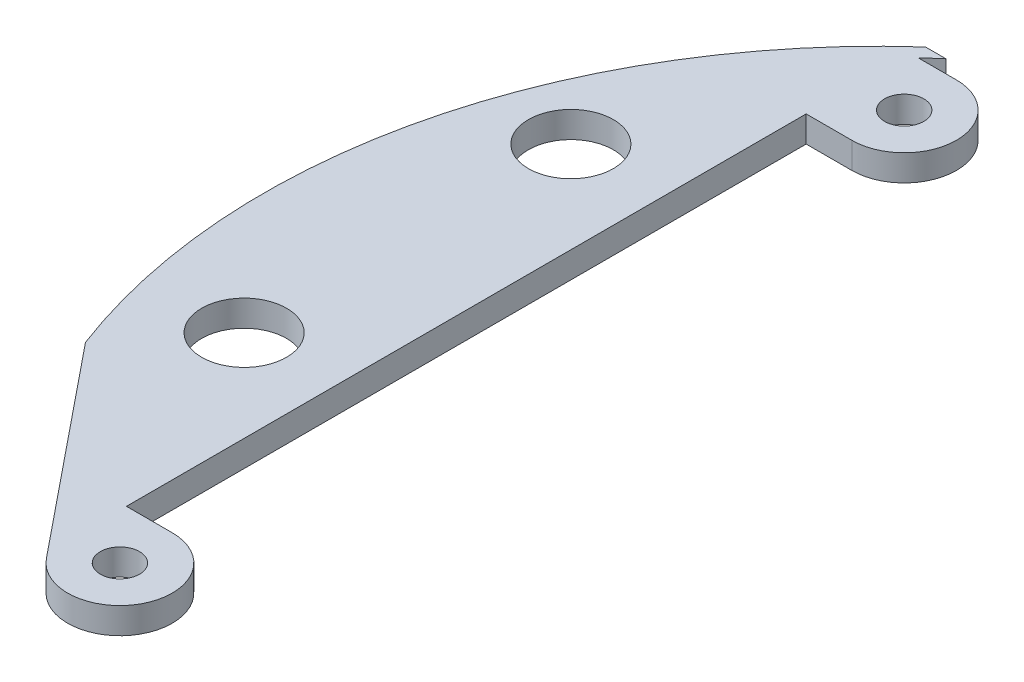
ISO-10303-21;
HEADER;
FILE_DESCRIPTION(('STEP AP214'),'2;1');
FILE_NAME('part.step','',(''),(''),'','','');
FILE_SCHEMA(('AUTOMOTIVE_DESIGN { 1 0 10303 214 1 1 1 1 }'));
ENDSEC;
DATA;
#1=APPLICATION_CONTEXT('core data for automotive mechanical design processes');
#2=APPLICATION_PROTOCOL_DEFINITION('international standard','automotive_design',2000,#1);
#3=PRODUCT_CONTEXT('',#1,'mechanical');
#4=PRODUCT('Part','Part','',(#3));
#5=PRODUCT_RELATED_PRODUCT_CATEGORY('part','',(#4));
#6=PRODUCT_DEFINITION_FORMATION('','',#4);
#7=PRODUCT_DEFINITION_CONTEXT('part definition',#1,'design');
#8=PRODUCT_DEFINITION('design','',#6,#7);
#9=PRODUCT_DEFINITION_SHAPE('','',#8);
#10=(LENGTH_UNIT() NAMED_UNIT(*) SI_UNIT(.MILLI.,.METRE.));
#11=(NAMED_UNIT(*) PLANE_ANGLE_UNIT() SI_UNIT($,.RADIAN.));
#12=(NAMED_UNIT(*) SI_UNIT($,.STERADIAN.) SOLID_ANGLE_UNIT());
#13=UNCERTAINTY_MEASURE_WITH_UNIT(LENGTH_MEASURE(1.E-05),#10,'distance_accuracy_value','');
#14=(GEOMETRIC_REPRESENTATION_CONTEXT(3) GLOBAL_UNCERTAINTY_ASSIGNED_CONTEXT((#13)) GLOBAL_UNIT_ASSIGNED_CONTEXT((#10,
#11,#12)) REPRESENTATION_CONTEXT('',''));
#15=CARTESIAN_POINT('',(0.,0.,0.));
#16=DIRECTION('',(0.,0.,1.));
#17=DIRECTION('',(1.,0.,0.));
#18=AXIS2_PLACEMENT_3D('',#15,#16,#17);
#19=CARTESIAN_POINT('',(0.,2.,0.));
#20=DIRECTION('',(0.,-1.,0.));
#21=DIRECTION('',(0.,0.,-1.));
#22=AXIS2_PLACEMENT_3D('',#19,#20,#21);
#23=PLANE('',#22);
#24=CARTESIAN_POINT('',(-10.5,2.,-15.));
#25=DIRECTION('',(0.,1.,0.));
#26=DIRECTION('',(0.,0.,1.));
#27=AXIS2_PLACEMENT_3D('',#24,#25,#26);
#28=CIRCLE('',#27,3.25);
#29=CARTESIAN_POINT('',(-10.5,2.,-11.75));
#30=VERTEX_POINT('',#29);
#31=EDGE_CURVE('E234',#30,#30,#28,.T.);
#32=ORIENTED_EDGE('',*,*,#31,.F.);
#33=EDGE_LOOP('',(#32));
#34=FACE_BOUND('',#33,.T.);
#35=CARTESIAN_POINT('',(-10.5,2.,10.));
#36=DIRECTION('',(0.,1.,0.));
#37=DIRECTION('',(0.,0.,1.));
#38=AXIS2_PLACEMENT_3D('',#35,#36,#37);
#39=CIRCLE('',#38,3.25);
#40=CARTESIAN_POINT('',(-10.5,2.,13.25));
#41=VERTEX_POINT('',#40);
#42=EDGE_CURVE('E238',#41,#41,#39,.T.);
#43=ORIENTED_EDGE('',*,*,#42,.F.);
#44=EDGE_LOOP('',(#43));
#45=FACE_BOUND('',#44,.T.);
#46=CARTESIAN_POINT('',(0.,2.,-30.));
#47=DIRECTION('',(0.,1.,0.));
#48=DIRECTION('',(0.,0.,1.));
#49=AXIS2_PLACEMENT_3D('',#46,#47,#48);
#50=CIRCLE('',#49,1.5);
#51=CARTESIAN_POINT('',(0.,2.,-28.5));
#52=VERTEX_POINT('',#51);
#53=EDGE_CURVE('E297',#52,#52,#50,.T.);
#54=ORIENTED_EDGE('',*,*,#53,.F.);
#55=EDGE_LOOP('',(#54));
#56=FACE_BOUND('',#55,.T.);
#57=CARTESIAN_POINT('',(0.,2.,30.));
#58=DIRECTION('',(0.,1.,0.));
#59=DIRECTION('',(0.,0.,1.));
#60=AXIS2_PLACEMENT_3D('',#57,#58,#59);
#61=CIRCLE('',#60,1.5);
#62=CARTESIAN_POINT('',(0.,2.,31.5));
#63=VERTEX_POINT('',#62);
#64=EDGE_CURVE('E291',#63,#63,#61,.T.);
#65=ORIENTED_EDGE('',*,*,#64,.F.);
#66=EDGE_LOOP('',(#65));
#67=FACE_BOUND('',#66,.T.);
#68=CARTESIAN_POINT('',(28.0000000000002,2.,0.));
#69=DIRECTION('',(0.,1.,0.));
#70=DIRECTION('',(0.,0.,1.));
#71=AXIS2_PLACEMENT_3D('',#68,#69,#70);
#72=CIRCLE('',#71,47.);
#73=CARTESIAN_POINT('',(-3.36877428271602,2.,-35.));
#74=VERTEX_POINT('',#73);
#75=CARTESIAN_POINT('',(-15.9316189320438,2.,16.7036779785075));
#76=VERTEX_POINT('',#75);
#77=EDGE_CURVE('E222',#74,#76,#72,.T.);
#78=ORIENTED_EDGE('',*,*,#77,.T.);
#79=DIRECTION('',(0.629837318418098,0.,0.77672707711776));
#80=VECTOR('',#79,1.);
#81=CARTESIAN_POINT('',(-17.7832592903084,2.,14.4202007038354));
#82=LINE('',#81,#80);
#83=CARTESIAN_POINT('',(-3.10690830847104,2.,32.5193492736724));
#84=VERTEX_POINT('',#83);
#85=EDGE_CURVE('E226',#76,#84,#82,.T.);
#86=ORIENTED_EDGE('',*,*,#85,.T.);
#87=CARTESIAN_POINT('',(0.,2.,30.));
#88=DIRECTION('',(0.,1.,0.));
#89=DIRECTION('',(0.,0.,1.));
#90=AXIS2_PLACEMENT_3D('',#87,#88,#89);
#91=CIRCLE('',#90,4.);
#92=CARTESIAN_POINT('',(0.,2.,26.));
#93=VERTEX_POINT('',#92);
#94=EDGE_CURVE('E228',#93,#84,#91,.F.);
#95=ORIENTED_EDGE('',*,*,#94,.F.);
#96=DIRECTION('',(1.,0.,0.));
#97=VECTOR('',#96,1.);
#98=CARTESIAN_POINT('',(-3.,2.,26.));
#99=LINE('',#98,#97);
#100=CARTESIAN_POINT('',(-3.5,2.,26.));
#101=VERTEX_POINT('',#100);
#102=EDGE_CURVE('E284',#101,#93,#99,.T.);
#103=ORIENTED_EDGE('',*,*,#102,.F.);
#104=DIRECTION('',(0.,0.,-1.));
#105=VECTOR('',#104,1.);
#106=CARTESIAN_POINT('',(-3.5,2.,0.));
#107=LINE('',#106,#105);
#108=CARTESIAN_POINT('',(-3.5,2.,-26.));
#109=VERTEX_POINT('',#108);
#110=EDGE_CURVE('E269',#101,#109,#107,.T.);
#111=ORIENTED_EDGE('',*,*,#110,.T.);
#112=DIRECTION('',(-1.,0.,0.));
#113=VECTOR('',#112,1.);
#114=CARTESIAN_POINT('',(-3.,2.,-26.));
#115=LINE('',#114,#113);
#116=CARTESIAN_POINT('',(0.,2.,-26.));
#117=VERTEX_POINT('',#116);
#118=EDGE_CURVE('E282',#117,#109,#115,.T.);
#119=ORIENTED_EDGE('',*,*,#118,.F.);
#120=CARTESIAN_POINT('',(0.,2.,-30.));
#121=DIRECTION('',(0.,1.,0.));
#122=DIRECTION('',(0.,0.,1.));
#123=AXIS2_PLACEMENT_3D('',#120,#121,#122);
#124=CIRCLE('',#123,4.);
#125=CARTESIAN_POINT('',(0.,2.,-34.));
#126=VERTEX_POINT('',#125);
#127=EDGE_CURVE('E143',#117,#126,#124,.T.);
#128=ORIENTED_EDGE('',*,*,#127,.T.);
#129=DIRECTION('',(-1.,0.,0.));
#130=VECTOR('',#129,1.);
#131=CARTESIAN_POINT('',(0.,2.,-34.));
#132=LINE('',#131,#130);
#133=CARTESIAN_POINT('',(-2.93362068832025,2.,-34.));
#134=VERTEX_POINT('',#133);
#135=EDGE_CURVE('E252',#126,#134,#132,.T.);
#136=ORIENTED_EDGE('',*,*,#135,.T.);
#137=CARTESIAN_POINT('',(28.0000000000002,2.,-0.129629629629611));
#138=DIRECTION('',(0.,1.,0.));
#139=DIRECTION('',(0.,0.,1.));
#140=AXIS2_PLACEMENT_3D('',#137,#138,#139);
#141=CIRCLE('',#140,45.8703703703704);
#142=CARTESIAN_POINT('',(-1.80181451100141,2.,-35.));
#143=VERTEX_POINT('',#142);
#144=EDGE_CURVE('E249',#143,#134,#141,.T.);
#145=ORIENTED_EDGE('',*,*,#144,.F.);
#146=DIRECTION('',(-1.,0.,0.));
#147=VECTOR('',#146,1.);
#148=CARTESIAN_POINT('',(-10.,2.,-35.));
#149=LINE('',#148,#147);
#150=EDGE_CURVE('E12',#143,#74,#149,.T.);
#151=ORIENTED_EDGE('',*,*,#150,.T.);
#152=EDGE_LOOP('',(#78,#86,#95,#103,#111,#119,#128,#136,#145,#151));
#153=FACE_BOUND('',#152,.T.);
#154=ADVANCED_FACE('F128',(#34,#45,#56,#67,#153),#23,.F.);
#155=CARTESIAN_POINT('',(0.,0.,0.));
#156=DIRECTION('',(0.,-1.,0.));
#157=DIRECTION('',(0.,0.,-1.));
#158=AXIS2_PLACEMENT_3D('',#155,#156,#157);
#159=PLANE('',#158);
#160=CARTESIAN_POINT('',(-10.5,0.,-15.));
#161=DIRECTION('',(0.,1.,0.));
#162=DIRECTION('',(0.,0.,1.));
#163=AXIS2_PLACEMENT_3D('',#160,#161,#162);
#164=CIRCLE('',#163,3.25);
#165=CARTESIAN_POINT('',(-10.5,0.,-11.75));
#166=VERTEX_POINT('',#165);
#167=EDGE_CURVE('E229',#166,#166,#164,.T.);
#168=ORIENTED_EDGE('',*,*,#167,.T.);
#169=EDGE_LOOP('',(#168));
#170=FACE_BOUND('',#169,.T.);
#171=CARTESIAN_POINT('',(-10.5,0.,10.));
#172=DIRECTION('',(0.,1.,0.));
#173=DIRECTION('',(0.,0.,1.));
#174=AXIS2_PLACEMENT_3D('',#171,#172,#173);
#175=CIRCLE('',#174,3.25);
#176=CARTESIAN_POINT('',(-10.5,0.,13.25));
#177=VERTEX_POINT('',#176);
#178=EDGE_CURVE('E471',#177,#177,#175,.T.);
#179=ORIENTED_EDGE('',*,*,#178,.T.);
#180=EDGE_LOOP('',(#179));
#181=FACE_BOUND('',#180,.T.);
#182=CARTESIAN_POINT('',(0.,0.,-30.));
#183=DIRECTION('',(0.,1.,0.));
#184=DIRECTION('',(0.,0.,1.));
#185=AXIS2_PLACEMENT_3D('',#182,#183,#184);
#186=CIRCLE('',#185,1.5);
#187=CARTESIAN_POINT('',(0.,0.,-28.5));
#188=VERTEX_POINT('',#187);
#189=EDGE_CURVE('E294',#188,#188,#186,.T.);
#190=ORIENTED_EDGE('',*,*,#189,.T.);
#191=EDGE_LOOP('',(#190));
#192=FACE_BOUND('',#191,.T.);
#193=CARTESIAN_POINT('',(0.,0.,30.));
#194=DIRECTION('',(0.,1.,0.));
#195=DIRECTION('',(0.,0.,1.));
#196=AXIS2_PLACEMENT_3D('',#193,#194,#195);
#197=CIRCLE('',#196,1.5);
#198=CARTESIAN_POINT('',(0.,0.,31.5));
#199=VERTEX_POINT('',#198);
#200=EDGE_CURVE('E288',#199,#199,#197,.T.);
#201=ORIENTED_EDGE('',*,*,#200,.T.);
#202=EDGE_LOOP('',(#201));
#203=FACE_BOUND('',#202,.T.);
#204=DIRECTION('',(0.629837318418098,0.,0.77672707711776));
#205=VECTOR('',#204,1.);
#206=CARTESIAN_POINT('',(-17.7832592903084,0.,14.4202007038354));
#207=LINE('',#206,#205);
#208=CARTESIAN_POINT('',(-15.9316189320438,0.,16.7036779785075));
#209=VERTEX_POINT('',#208);
#210=CARTESIAN_POINT('',(-3.10690830847104,0.,32.5193492736724));
#211=VERTEX_POINT('',#210);
#212=EDGE_CURVE('E205',#209,#211,#207,.T.);
#213=ORIENTED_EDGE('',*,*,#212,.F.);
#214=CARTESIAN_POINT('',(28.0000000000002,0.,0.));
#215=DIRECTION('',(0.,1.,0.));
#216=DIRECTION('',(0.,0.,1.));
#217=AXIS2_PLACEMENT_3D('',#214,#215,#216);
#218=CIRCLE('',#217,47.);
#219=CARTESIAN_POINT('',(-3.36877428271602,0.,-35.));
#220=VERTEX_POINT('',#219);
#221=EDGE_CURVE('E209',#220,#209,#218,.T.);
#222=ORIENTED_EDGE('',*,*,#221,.F.);
#223=DIRECTION('',(-1.,0.,0.));
#224=VECTOR('',#223,1.);
#225=CARTESIAN_POINT('',(-10.,0.,-35.));
#226=LINE('',#225,#224);
#227=CARTESIAN_POINT('',(-1.80181451100141,0.,-35.));
#228=VERTEX_POINT('',#227);
#229=EDGE_CURVE('E132',#228,#220,#226,.T.);
#230=ORIENTED_EDGE('',*,*,#229,.F.);
#231=CARTESIAN_POINT('',(28.0000000000002,0.,-0.129629629629611));
#232=DIRECTION('',(0.,1.,0.));
#233=DIRECTION('',(0.,0.,1.));
#234=AXIS2_PLACEMENT_3D('',#231,#232,#233);
#235=CIRCLE('',#234,45.8703703703704);
#236=CARTESIAN_POINT('',(-2.93362068832025,0.,-34.));
#237=VERTEX_POINT('',#236);
#238=EDGE_CURVE('E214',#228,#237,#235,.T.);
#239=ORIENTED_EDGE('',*,*,#238,.T.);
#240=DIRECTION('',(-1.,0.,0.));
#241=VECTOR('',#240,1.);
#242=CARTESIAN_POINT('',(0.,0.,-34.));
#243=LINE('',#242,#241);
#244=CARTESIAN_POINT('',(0.,0.,-34.));
#245=VERTEX_POINT('',#244);
#246=EDGE_CURVE('E243',#245,#237,#243,.T.);
#247=ORIENTED_EDGE('',*,*,#246,.F.);
#248=CARTESIAN_POINT('',(0.,0.,-30.));
#249=DIRECTION('',(0.,1.,0.));
#250=DIRECTION('',(0.,0.,1.));
#251=AXIS2_PLACEMENT_3D('',#248,#249,#250);
#252=CIRCLE('',#251,4.);
#253=CARTESIAN_POINT('',(0.,0.,-26.));
#254=VERTEX_POINT('',#253);
#255=EDGE_CURVE('E245',#254,#245,#252,.T.);
#256=ORIENTED_EDGE('',*,*,#255,.F.);
#257=DIRECTION('',(-1.,0.,0.));
#258=VECTOR('',#257,1.);
#259=CARTESIAN_POINT('',(-3.,0.,-26.));
#260=LINE('',#259,#258);
#261=CARTESIAN_POINT('',(-3.5,0.,-26.));
#262=VERTEX_POINT('',#261);
#263=EDGE_CURVE('E279',#254,#262,#260,.T.);
#264=ORIENTED_EDGE('',*,*,#263,.T.);
#265=DIRECTION('',(0.,0.,-1.));
#266=VECTOR('',#265,1.);
#267=CARTESIAN_POINT('',(-3.5,0.,0.));
#268=LINE('',#267,#266);
#269=CARTESIAN_POINT('',(-3.5,0.,26.));
#270=VERTEX_POINT('',#269);
#271=EDGE_CURVE('E270',#270,#262,#268,.T.);
#272=ORIENTED_EDGE('',*,*,#271,.F.);
#273=DIRECTION('',(1.,0.,0.));
#274=VECTOR('',#273,1.);
#275=CARTESIAN_POINT('',(-3.,0.,26.));
#276=LINE('',#275,#274);
#277=CARTESIAN_POINT('',(0.,0.,26.));
#278=VERTEX_POINT('',#277);
#279=EDGE_CURVE('E285',#270,#278,#276,.T.);
#280=ORIENTED_EDGE('',*,*,#279,.T.);
#281=CARTESIAN_POINT('',(0.,0.,30.));
#282=DIRECTION('',(0.,1.,0.));
#283=DIRECTION('',(0.,0.,1.));
#284=AXIS2_PLACEMENT_3D('',#281,#282,#283);
#285=CIRCLE('',#284,4.);
#286=EDGE_CURVE('E151',#278,#211,#285,.F.);
#287=ORIENTED_EDGE('',*,*,#286,.T.);
#288=EDGE_LOOP('',(#213,#222,#230,#239,#247,#256,#264,#272,#280,#287));
#289=FACE_BOUND('',#288,.T.);
#290=ADVANCED_FACE('F207',(#170,#181,#192,#203,#289),#159,.T.);
#291=CARTESIAN_POINT('',(-10.,2.,-35.));
#292=DIRECTION('',(0.,0.,1.));
#293=DIRECTION('',(1.,0.,0.));
#294=AXIS2_PLACEMENT_3D('',#291,#292,#293);
#295=PLANE('',#294);
#296=DIRECTION('',(0.,1.,0.));
#297=VECTOR('',#296,1.);
#298=CARTESIAN_POINT('',(-3.36877428271602,0.,-35.));
#299=LINE('',#298,#297);
#300=EDGE_CURVE('E221',#220,#74,#299,.T.);
#301=ORIENTED_EDGE('',*,*,#300,.T.);
#302=ORIENTED_EDGE('',*,*,#150,.F.);
#303=DIRECTION('',(0.,1.,0.));
#304=VECTOR('',#303,1.);
#305=CARTESIAN_POINT('',(-1.80181451100141,0.,-35.));
#306=LINE('',#305,#304);
#307=EDGE_CURVE('E262',#228,#143,#306,.T.);
#308=ORIENTED_EDGE('',*,*,#307,.F.);
#309=ORIENTED_EDGE('',*,*,#229,.T.);
#310=EDGE_LOOP('',(#301,#302,#308,#309));
#311=FACE_BOUND('',#310,.T.);
#312=ADVANCED_FACE('F130',(#311),#295,.F.);
#313=CARTESIAN_POINT('',(-3.,2.,-26.));
#314=DIRECTION('',(0.,0.,1.));
#315=DIRECTION('',(1.,0.,0.));
#316=AXIS2_PLACEMENT_3D('',#313,#314,#315);
#317=PLANE('',#316);
#318=ORIENTED_EDGE('',*,*,#263,.F.);
#319=DIRECTION('',(0.,1.,0.));
#320=VECTOR('',#319,1.);
#321=CARTESIAN_POINT('',(0.,0.,-26.));
#322=LINE('',#321,#320);
#323=EDGE_CURVE('E256',#254,#117,#322,.T.);
#324=ORIENTED_EDGE('',*,*,#323,.T.);
#325=ORIENTED_EDGE('',*,*,#118,.T.);
#326=DIRECTION('',(0.,1.,0.));
#327=VECTOR('',#326,1.);
#328=CARTESIAN_POINT('',(-3.5,0.,-26.));
#329=LINE('',#328,#327);
#330=EDGE_CURVE('E273',#262,#109,#329,.T.);
#331=ORIENTED_EDGE('',*,*,#330,.F.);
#332=EDGE_LOOP('',(#318,#324,#325,#331));
#333=FACE_BOUND('',#332,.T.);
#334=ADVANCED_FACE('F318',(#333),#317,.T.);
#335=CARTESIAN_POINT('',(-3.,2.,26.));
#336=DIRECTION('',(0.,0.,-1.));
#337=DIRECTION('',(-1.,0.,0.));
#338=AXIS2_PLACEMENT_3D('',#335,#336,#337);
#339=PLANE('',#338);
#340=ORIENTED_EDGE('',*,*,#102,.T.);
#341=DIRECTION('',(0.,1.,0.));
#342=VECTOR('',#341,1.);
#343=CARTESIAN_POINT('',(0.,0.,26.));
#344=LINE('',#343,#342);
#345=EDGE_CURVE('E246',#278,#93,#344,.T.);
#346=ORIENTED_EDGE('',*,*,#345,.F.);
#347=ORIENTED_EDGE('',*,*,#279,.F.);
#348=DIRECTION('',(0.,1.,0.));
#349=VECTOR('',#348,1.);
#350=CARTESIAN_POINT('',(-3.5,0.,26.));
#351=LINE('',#350,#349);
#352=EDGE_CURVE('E276',#270,#101,#351,.T.);
#353=ORIENTED_EDGE('',*,*,#352,.T.);
#354=EDGE_LOOP('',(#340,#346,#347,#353));
#355=FACE_BOUND('',#354,.T.);
#356=ADVANCED_FACE('F308',(#355),#339,.T.);
#357=CARTESIAN_POINT('',(0.,2.,-30.));
#358=DIRECTION('',(0.,-1.,0.));
#359=DIRECTION('',(0.,0.,-1.));
#360=AXIS2_PLACEMENT_3D('',#357,#358,#359);
#361=CYLINDRICAL_SURFACE('',#360,1.5);
#362=ORIENTED_EDGE('',*,*,#53,.T.);
#363=EDGE_LOOP('',(#362));
#364=FACE_BOUND('',#363,.T.);
#365=ORIENTED_EDGE('',*,*,#189,.F.);
#366=EDGE_LOOP('',(#365));
#367=FACE_BOUND('',#366,.T.);
#368=ADVANCED_FACE('F305',(#364,#367),#361,.F.);
#369=CARTESIAN_POINT('',(0.,2.,30.));
#370=DIRECTION('',(0.,-1.,0.));
#371=DIRECTION('',(0.,0.,-1.));
#372=AXIS2_PLACEMENT_3D('',#369,#370,#371);
#373=CYLINDRICAL_SURFACE('',#372,1.5);
#374=ORIENTED_EDGE('',*,*,#64,.T.);
#375=EDGE_LOOP('',(#374));
#376=FACE_BOUND('',#375,.T.);
#377=ORIENTED_EDGE('',*,*,#200,.F.);
#378=EDGE_LOOP('',(#377));
#379=FACE_BOUND('',#378,.T.);
#380=ADVANCED_FACE('F307',(#376,#379),#373,.F.);
#381=CARTESIAN_POINT('',(-3.5,0.,0.));
#382=DIRECTION('',(1.,0.,0.));
#383=DIRECTION('',(0.,0.,-1.));
#384=AXIS2_PLACEMENT_3D('',#381,#382,#383);
#385=PLANE('',#384);
#386=ORIENTED_EDGE('',*,*,#110,.F.);
#387=ORIENTED_EDGE('',*,*,#352,.F.);
#388=ORIENTED_EDGE('',*,*,#271,.T.);
#389=ORIENTED_EDGE('',*,*,#330,.T.);
#390=EDGE_LOOP('',(#386,#387,#388,#389));
#391=FACE_BOUND('',#390,.T.);
#392=ADVANCED_FACE('F314',(#391),#385,.T.);
#393=CARTESIAN_POINT('',(0.,0.,30.));
#394=DIRECTION('',(0.,1.,0.));
#395=DIRECTION('',(0.,0.,1.));
#396=AXIS2_PLACEMENT_3D('',#393,#394,#395);
#397=CYLINDRICAL_SURFACE('',#396,4.);
#398=ORIENTED_EDGE('',*,*,#94,.T.);
#399=DIRECTION('',(0.,1.,0.));
#400=VECTOR('',#399,1.);
#401=CARTESIAN_POINT('',(-3.10690830847104,0.,32.5193492736724));
#402=LINE('',#401,#400);
#403=EDGE_CURVE('E264',#211,#84,#402,.T.);
#404=ORIENTED_EDGE('',*,*,#403,.F.);
#405=ORIENTED_EDGE('',*,*,#286,.F.);
#406=ORIENTED_EDGE('',*,*,#345,.T.);
#407=EDGE_LOOP('',(#398,#404,#405,#406));
#408=FACE_BOUND('',#407,.T.);
#409=ADVANCED_FACE('F362',(#408),#397,.T.);
#410=CARTESIAN_POINT('',(-17.7832592903084,0.,14.4202007038354));
#411=DIRECTION('',(-0.77672707711776,0.,0.629837318418098));
#412=DIRECTION('',(0.629837318418098,0.,0.77672707711776));
#413=AXIS2_PLACEMENT_3D('',#410,#411,#412);
#414=PLANE('',#413);
#415=ORIENTED_EDGE('',*,*,#85,.F.);
#416=DIRECTION('',(0.,1.,0.));
#417=VECTOR('',#416,1.);
#418=CARTESIAN_POINT('',(-15.9316189320438,0.,16.7036779785075));
#419=LINE('',#418,#417);
#420=EDGE_CURVE('E219',#209,#76,#419,.T.);
#421=ORIENTED_EDGE('',*,*,#420,.F.);
#422=ORIENTED_EDGE('',*,*,#212,.T.);
#423=ORIENTED_EDGE('',*,*,#403,.T.);
#424=EDGE_LOOP('',(#415,#421,#422,#423));
#425=FACE_BOUND('',#424,.T.);
#426=ADVANCED_FACE('F224',(#425),#414,.T.);
#427=CARTESIAN_POINT('',(0.,0.,-30.));
#428=DIRECTION('',(0.,1.,0.));
#429=DIRECTION('',(0.,0.,1.));
#430=AXIS2_PLACEMENT_3D('',#427,#428,#429);
#431=CYLINDRICAL_SURFACE('',#430,4.);
#432=ORIENTED_EDGE('',*,*,#127,.F.);
#433=ORIENTED_EDGE('',*,*,#323,.F.);
#434=ORIENTED_EDGE('',*,*,#255,.T.);
#435=DIRECTION('',(0.,1.,0.));
#436=VECTOR('',#435,1.);
#437=CARTESIAN_POINT('',(0.,0.,-34.));
#438=LINE('',#437,#436);
#439=EDGE_CURVE('E258',#245,#126,#438,.T.);
#440=ORIENTED_EDGE('',*,*,#439,.T.);
#441=EDGE_LOOP('',(#432,#433,#434,#440));
#442=FACE_BOUND('',#441,.T.);
#443=ADVANCED_FACE('F353',(#442),#431,.T.);
#444=CARTESIAN_POINT('',(0.,0.,-34.));
#445=DIRECTION('',(0.,0.,-1.));
#446=DIRECTION('',(-1.,0.,0.));
#447=AXIS2_PLACEMENT_3D('',#444,#445,#446);
#448=PLANE('',#447);
#449=ORIENTED_EDGE('',*,*,#135,.F.);
#450=ORIENTED_EDGE('',*,*,#439,.F.);
#451=ORIENTED_EDGE('',*,*,#246,.T.);
#452=DIRECTION('',(0.,1.,0.));
#453=VECTOR('',#452,1.);
#454=CARTESIAN_POINT('',(-2.93362068832025,0.,-34.));
#455=LINE('',#454,#453);
#456=EDGE_CURVE('E260',#237,#134,#455,.T.);
#457=ORIENTED_EDGE('',*,*,#456,.T.);
#458=EDGE_LOOP('',(#449,#450,#451,#457));
#459=FACE_BOUND('',#458,.T.);
#460=ADVANCED_FACE('F351',(#459),#448,.T.);
#461=CARTESIAN_POINT('',(28.0000000000002,0.,-0.129629629629611));
#462=DIRECTION('',(0.,1.,0.));
#463=DIRECTION('',(0.,0.,1.));
#464=AXIS2_PLACEMENT_3D('',#461,#462,#463);
#465=CYLINDRICAL_SURFACE('',#464,45.8703703703704);
#466=ORIENTED_EDGE('',*,*,#144,.T.);
#467=ORIENTED_EDGE('',*,*,#456,.F.);
#468=ORIENTED_EDGE('',*,*,#238,.F.);
#469=ORIENTED_EDGE('',*,*,#307,.T.);
#470=EDGE_LOOP('',(#466,#467,#468,#469));
#471=FACE_BOUND('',#470,.T.);
#472=ADVANCED_FACE('F348',(#471),#465,.F.);
#473=CARTESIAN_POINT('',(28.0000000000002,0.,0.));
#474=DIRECTION('',(0.,1.,0.));
#475=DIRECTION('',(0.,0.,1.));
#476=AXIS2_PLACEMENT_3D('',#473,#474,#475);
#477=CYLINDRICAL_SURFACE('',#476,47.);
#478=ORIENTED_EDGE('',*,*,#77,.F.);
#479=ORIENTED_EDGE('',*,*,#300,.F.);
#480=ORIENTED_EDGE('',*,*,#221,.T.);
#481=ORIENTED_EDGE('',*,*,#420,.T.);
#482=EDGE_LOOP('',(#478,#479,#480,#481));
#483=FACE_BOUND('',#482,.T.);
#484=ADVANCED_FACE('F218',(#483),#477,.T.);
#485=CARTESIAN_POINT('',(-10.5,0.,10.));
#486=DIRECTION('',(0.,1.,0.));
#487=DIRECTION('',(0.,0.,1.));
#488=AXIS2_PLACEMENT_3D('',#485,#486,#487);
#489=CYLINDRICAL_SURFACE('',#488,3.25);
#490=ORIENTED_EDGE('',*,*,#178,.F.);
#491=EDGE_LOOP('',(#490));
#492=FACE_BOUND('',#491,.T.);
#493=ORIENTED_EDGE('',*,*,#42,.T.);
#494=EDGE_LOOP('',(#493));
#495=FACE_BOUND('',#494,.T.);
#496=ADVANCED_FACE('F374',(#492,#495),#489,.F.);
#497=CARTESIAN_POINT('',(-10.5,0.,-15.));
#498=DIRECTION('',(0.,1.,0.));
#499=DIRECTION('',(0.,0.,1.));
#500=AXIS2_PLACEMENT_3D('',#497,#498,#499);
#501=CYLINDRICAL_SURFACE('',#500,3.25);
#502=ORIENTED_EDGE('',*,*,#167,.F.);
#503=EDGE_LOOP('',(#502));
#504=FACE_BOUND('',#503,.T.);
#505=ORIENTED_EDGE('',*,*,#31,.T.);
#506=EDGE_LOOP('',(#505));
#507=FACE_BOUND('',#506,.T.);
#508=ADVANCED_FACE('F455',(#504,#507),#501,.F.);
#509=CLOSED_SHELL('',(#154,#290,#312,#334,#356,#368,#380,#392,#409,#426,#443,#460,#472,#484,
#496,#508));
#510=MANIFOLD_SOLID_BREP('B2',#509);
#511=ADVANCED_BREP_SHAPE_REPRESENTATION('',(#18,#510),#14);
#512=SHAPE_DEFINITION_REPRESENTATION(#9,#511);
ENDSEC;
END-ISO-10303-21;
